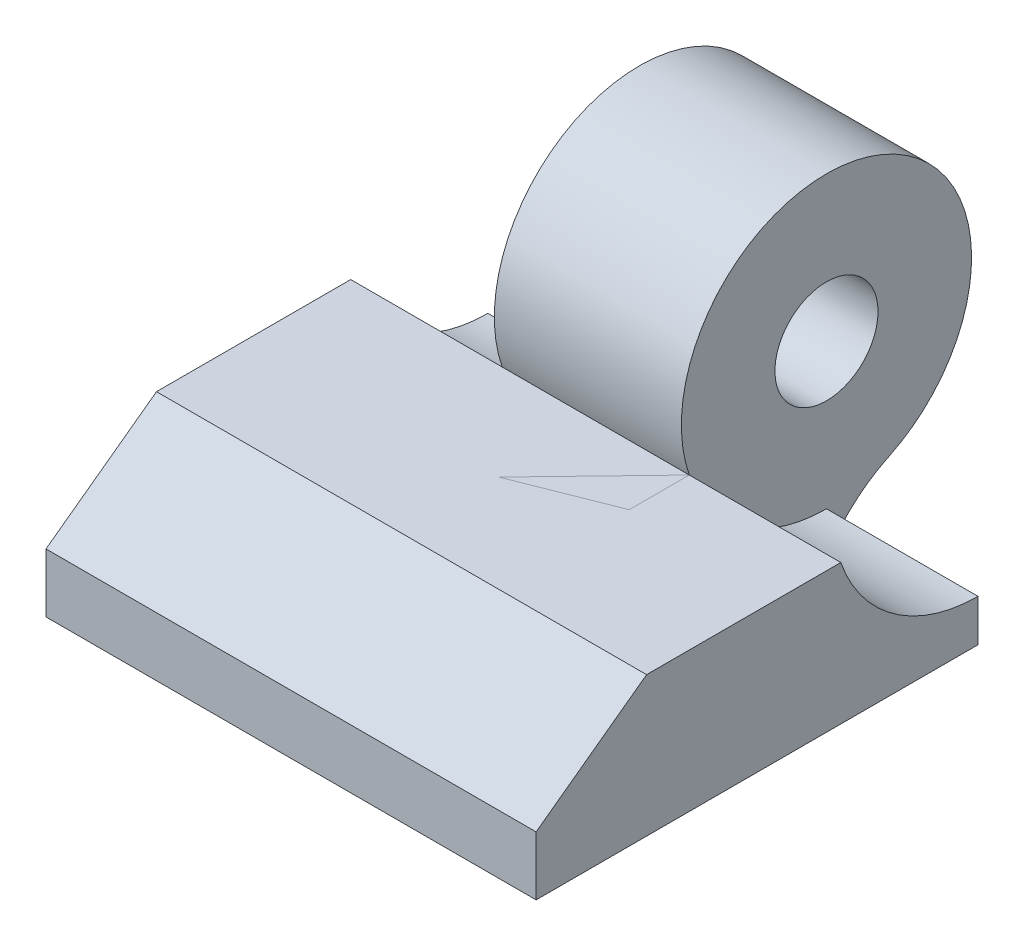
ISO-10303-21;
HEADER;
FILE_DESCRIPTION(('STEP AP214'),'2;1');
FILE_NAME('part.step','',(''),(''),'','','');
FILE_SCHEMA(('AUTOMOTIVE_DESIGN { 1 0 10303 214 1 1 1 1 }'));
ENDSEC;
DATA;
#1=APPLICATION_CONTEXT('core data for automotive mechanical design processes');
#2=APPLICATION_PROTOCOL_DEFINITION('international standard','automotive_design',2000,#1);
#3=PRODUCT_CONTEXT('',#1,'mechanical');
#4=PRODUCT('Part','Part','',(#3));
#5=PRODUCT_RELATED_PRODUCT_CATEGORY('part','',(#4));
#6=PRODUCT_DEFINITION_FORMATION('','',#4);
#7=PRODUCT_DEFINITION_CONTEXT('part definition',#1,'design');
#8=PRODUCT_DEFINITION('design','',#6,#7);
#9=PRODUCT_DEFINITION_SHAPE('','',#8);
#10=(LENGTH_UNIT() NAMED_UNIT(*) SI_UNIT(.MILLI.,.METRE.));
#11=(NAMED_UNIT(*) PLANE_ANGLE_UNIT() SI_UNIT($,.RADIAN.));
#12=(NAMED_UNIT(*) SI_UNIT($,.STERADIAN.) SOLID_ANGLE_UNIT());
#13=UNCERTAINTY_MEASURE_WITH_UNIT(LENGTH_MEASURE(1.E-05),#10,'distance_accuracy_value','');
#14=(GEOMETRIC_REPRESENTATION_CONTEXT(3) GLOBAL_UNCERTAINTY_ASSIGNED_CONTEXT((#13)) GLOBAL_UNIT_ASSIGNED_CONTEXT((#10,
#11,#12)) REPRESENTATION_CONTEXT('',''));
#15=CARTESIAN_POINT('',(0.,0.,0.));
#16=DIRECTION('',(0.,0.,1.));
#17=DIRECTION('',(1.,0.,0.));
#18=AXIS2_PLACEMENT_3D('',#15,#16,#17);
#19=CARTESIAN_POINT('',(16.637,0.,0.));
#20=DIRECTION('',(-1.,0.,0.));
#21=DIRECTION('',(0.,0.,1.));
#22=AXIS2_PLACEMENT_3D('',#19,#20,#21);
#23=CYLINDRICAL_SURFACE('',#22,9.85);
#24=CARTESIAN_POINT('',(-16.637,0.,0.));
#25=DIRECTION('',(1.,0.,0.));
#26=DIRECTION('',(0.,0.,-1.));
#27=AXIS2_PLACEMENT_3D('',#24,#25,#26);
#28=CIRCLE('',#27,9.85);
#29=CARTESIAN_POINT('',(-16.637,-3.20486621630946,9.31403953908068));
#30=VERTEX_POINT('',#29);
#31=CARTESIAN_POINT('',(-16.637,-9.85,0.));
#32=VERTEX_POINT('',#31);
#33=EDGE_CURVE('E132',#30,#32,#28,.T.);
#34=ORIENTED_EDGE('',*,*,#33,.F.);
#35=DIRECTION('',(-1.,0.,0.));
#36=VECTOR('',#35,1.);
#37=CARTESIAN_POINT('',(16.637,-3.20486621630946,9.31403953908068));
#38=LINE('',#37,#36);
#39=CARTESIAN_POINT('',(16.637,-3.20486621630946,9.31403953908068));
#40=VERTEX_POINT('',#39);
#41=EDGE_CURVE('E12',#40,#30,#38,.T.);
#42=ORIENTED_EDGE('',*,*,#41,.F.);
#43=CARTESIAN_POINT('',(16.637,0.,0.));
#44=DIRECTION('',(1.,0.,0.));
#45=DIRECTION('',(0.,0.,-1.));
#46=AXIS2_PLACEMENT_3D('',#43,#44,#45);
#47=CIRCLE('',#46,9.85);
#48=CARTESIAN_POINT('',(16.637,-9.85,0.));
#49=VERTEX_POINT('',#48);
#50=EDGE_CURVE('E143',#40,#49,#47,.T.);
#51=ORIENTED_EDGE('',*,*,#50,.T.);
#52=DIRECTION('',(-1.,0.,0.));
#53=VECTOR('',#52,1.);
#54=CARTESIAN_POINT('',(16.637,-9.85,0.));
#55=LINE('',#54,#53);
#56=EDGE_CURVE('E96',#49,#32,#55,.T.);
#57=ORIENTED_EDGE('',*,*,#56,.T.);
#58=EDGE_LOOP('',(#34,#42,#51,#57));
#59=FACE_BOUND('',#58,.T.);
#60=ADVANCED_FACE('F51',(#59),#23,.F.);
#61=CARTESIAN_POINT('',(16.637,-3.20486621630946,0.));
#62=DIRECTION('',(0.,-1.,0.));
#63=DIRECTION('',(0.,0.,-1.));
#64=AXIS2_PLACEMENT_3D('',#61,#62,#63);
#65=PLANE('',#64);
#66=DIRECTION('',(0.,0.,1.));
#67=VECTOR('',#66,1.);
#68=CARTESIAN_POINT('',(-16.637,-3.20486621630946,0.));
#69=LINE('',#68,#67);
#70=CARTESIAN_POINT('',(-16.637,-3.20486621630946,22.5));
#71=VERTEX_POINT('',#70);
#72=EDGE_CURVE('E135',#30,#71,#69,.T.);
#73=ORIENTED_EDGE('',*,*,#72,.T.);
#74=DIRECTION('',(-1.,0.,0.));
#75=VECTOR('',#74,1.);
#76=CARTESIAN_POINT('',(16.637,-3.20486621630946,22.5));
#77=LINE('',#76,#75);
#78=CARTESIAN_POINT('',(16.637,-3.20486621630946,22.5));
#79=VERTEX_POINT('',#78);
#80=EDGE_CURVE('E59',#79,#71,#77,.T.);
#81=ORIENTED_EDGE('',*,*,#80,.F.);
#82=DIRECTION('',(0.,0.,1.));
#83=VECTOR('',#82,1.);
#84=CARTESIAN_POINT('',(16.637,-3.20486621630946,0.));
#85=LINE('',#84,#83);
#86=EDGE_CURVE('E158',#40,#79,#85,.T.);
#87=ORIENTED_EDGE('',*,*,#86,.F.);
#88=ORIENTED_EDGE('',*,*,#41,.T.);
#89=EDGE_LOOP('',(#73,#81,#87,#88));
#90=FACE_BOUND('',#89,.T.);
#91=ADVANCED_FACE('F161',(#90),#65,.F.);
#92=CARTESIAN_POINT('',(16.637,8.64153137420128,6.33151613295937));
#93=DIRECTION('',(0.,-0.806654513100805,-0.591023262227557));
#94=DIRECTION('',(0.,0.591023262227557,-0.806654513100805));
#95=AXIS2_PLACEMENT_3D('',#92,#93,#94);
#96=PLANE('',#95);
#97=DIRECTION('',(0.,-0.591023262227557,0.806654513100805));
#98=VECTOR('',#97,1.);
#99=CARTESIAN_POINT('',(-16.637,8.64153137420128,6.33151613295937));
#100=LINE('',#99,#98);
#101=CARTESIAN_POINT('',(-16.637,-8.7,30.));
#102=VERTEX_POINT('',#101);
#103=EDGE_CURVE('E137',#71,#102,#100,.T.);
#104=ORIENTED_EDGE('',*,*,#103,.T.);
#105=DIRECTION('',(-1.,0.,0.));
#106=VECTOR('',#105,1.);
#107=CARTESIAN_POINT('',(16.637,-8.7,30.));
#108=LINE('',#107,#106);
#109=CARTESIAN_POINT('',(16.637,-8.7,30.));
#110=VERTEX_POINT('',#109);
#111=EDGE_CURVE('E124',#110,#102,#108,.T.);
#112=ORIENTED_EDGE('',*,*,#111,.F.);
#113=DIRECTION('',(0.,-0.591023262227557,0.806654513100805));
#114=VECTOR('',#113,1.);
#115=CARTESIAN_POINT('',(16.637,8.64153137420128,6.33151613295937));
#116=LINE('',#115,#114);
#117=EDGE_CURVE('E115',#79,#110,#116,.T.);
#118=ORIENTED_EDGE('',*,*,#117,.F.);
#119=ORIENTED_EDGE('',*,*,#80,.T.);
#120=EDGE_LOOP('',(#104,#112,#118,#119));
#121=FACE_BOUND('',#120,.T.);
#122=ADVANCED_FACE('F150',(#121),#96,.F.);
#123=CARTESIAN_POINT('',(16.637,0.,30.));
#124=DIRECTION('',(0.,0.,-1.));
#125=DIRECTION('',(-1.,0.,0.));
#126=AXIS2_PLACEMENT_3D('',#123,#124,#125);
#127=PLANE('',#126);
#128=DIRECTION('',(0.,-1.,0.));
#129=VECTOR('',#128,1.);
#130=CARTESIAN_POINT('',(-16.637,0.,30.));
#131=LINE('',#130,#129);
#132=CARTESIAN_POINT('',(-16.637,-12.7,30.));
#133=VERTEX_POINT('',#132);
#134=EDGE_CURVE('E123',#102,#133,#131,.T.);
#135=ORIENTED_EDGE('',*,*,#134,.T.);
#136=DIRECTION('',(-1.,0.,0.));
#137=VECTOR('',#136,1.);
#138=CARTESIAN_POINT('',(16.637,-12.7,30.));
#139=LINE('',#138,#137);
#140=CARTESIAN_POINT('',(16.637,-12.7,30.));
#141=VERTEX_POINT('',#140);
#142=EDGE_CURVE('E120',#141,#133,#139,.T.);
#143=ORIENTED_EDGE('',*,*,#142,.F.);
#144=DIRECTION('',(0.,-1.,0.));
#145=VECTOR('',#144,1.);
#146=CARTESIAN_POINT('',(16.637,0.,30.));
#147=LINE('',#146,#145);
#148=EDGE_CURVE('E109',#110,#141,#147,.T.);
#149=ORIENTED_EDGE('',*,*,#148,.F.);
#150=ORIENTED_EDGE('',*,*,#111,.T.);
#151=EDGE_LOOP('',(#135,#143,#149,#150));
#152=FACE_BOUND('',#151,.T.);
#153=ADVANCED_FACE('F121',(#152),#127,.F.);
#154=CARTESIAN_POINT('',(16.637,-12.7,0.));
#155=DIRECTION('',(0.,1.,0.));
#156=DIRECTION('',(0.,0.,1.));
#157=AXIS2_PLACEMENT_3D('',#154,#155,#156);
#158=PLANE('',#157);
#159=DIRECTION('',(0.,0.,-1.));
#160=VECTOR('',#159,1.);
#161=CARTESIAN_POINT('',(-16.637,-12.7,0.));
#162=LINE('',#161,#160);
#163=CARTESIAN_POINT('',(-16.637,-12.7,0.));
#164=VERTEX_POINT('',#163);
#165=EDGE_CURVE('E89',#133,#164,#162,.T.);
#166=ORIENTED_EDGE('',*,*,#165,.T.);
#167=DIRECTION('',(-1.,0.,0.));
#168=VECTOR('',#167,1.);
#169=CARTESIAN_POINT('',(16.637,-12.7,0.));
#170=LINE('',#169,#168);
#171=CARTESIAN_POINT('',(16.637,-12.7,0.));
#172=VERTEX_POINT('',#171);
#173=EDGE_CURVE('E125',#172,#164,#170,.T.);
#174=ORIENTED_EDGE('',*,*,#173,.F.);
#175=DIRECTION('',(0.,0.,-1.));
#176=VECTOR('',#175,1.);
#177=CARTESIAN_POINT('',(16.637,-12.7,0.));
#178=LINE('',#177,#176);
#179=EDGE_CURVE('E113',#141,#172,#178,.T.);
#180=ORIENTED_EDGE('',*,*,#179,.F.);
#181=ORIENTED_EDGE('',*,*,#142,.T.);
#182=EDGE_LOOP('',(#166,#174,#180,#181));
#183=FACE_BOUND('',#182,.T.);
#184=ADVANCED_FACE('F127',(#183),#158,.F.);
#185=CARTESIAN_POINT('',(16.637,0.,0.));
#186=DIRECTION('',(0.,0.,1.));
#187=DIRECTION('',(0.,-1.,0.));
#188=AXIS2_PLACEMENT_3D('',#185,#186,#187);
#189=PLANE('',#188);
#190=DIRECTION('',(0.,1.,0.));
#191=VECTOR('',#190,1.);
#192=CARTESIAN_POINT('',(-16.637,0.,0.));
#193=LINE('',#192,#191);
#194=EDGE_CURVE('E141',#164,#32,#193,.T.);
#195=ORIENTED_EDGE('',*,*,#194,.T.);
#196=ORIENTED_EDGE('',*,*,#56,.F.);
#197=DIRECTION('',(0.,1.,0.));
#198=VECTOR('',#197,1.);
#199=CARTESIAN_POINT('',(16.637,0.,0.));
#200=LINE('',#199,#198);
#201=EDGE_CURVE('E67',#172,#49,#200,.T.);
#202=ORIENTED_EDGE('',*,*,#201,.F.);
#203=ORIENTED_EDGE('',*,*,#173,.T.);
#204=EDGE_LOOP('',(#195,#196,#202,#203));
#205=FACE_BOUND('',#204,.T.);
#206=ADVANCED_FACE('F157',(#205),#189,.F.);
#207=CARTESIAN_POINT('',(16.637,0.,0.));
#208=DIRECTION('',(1.,0.,0.));
#209=DIRECTION('',(0.,0.,-1.));
#210=AXIS2_PLACEMENT_3D('',#207,#208,#209);
#211=PLANE('',#210);
#212=ORIENTED_EDGE('',*,*,#50,.F.);
#213=ORIENTED_EDGE('',*,*,#86,.T.);
#214=ORIENTED_EDGE('',*,*,#117,.T.);
#215=ORIENTED_EDGE('',*,*,#148,.T.);
#216=ORIENTED_EDGE('',*,*,#179,.T.);
#217=ORIENTED_EDGE('',*,*,#201,.T.);
#218=EDGE_LOOP('',(#212,#213,#214,#215,#216,#217));
#219=FACE_BOUND('',#218,.T.);
#220=ADVANCED_FACE('F111',(#219),#211,.T.);
#221=CARTESIAN_POINT('',(-16.637,0.,0.));
#222=DIRECTION('',(1.,0.,0.));
#223=DIRECTION('',(0.,0.,-1.));
#224=AXIS2_PLACEMENT_3D('',#221,#222,#223);
#225=PLANE('',#224);
#226=ORIENTED_EDGE('',*,*,#33,.T.);
#227=ORIENTED_EDGE('',*,*,#194,.F.);
#228=ORIENTED_EDGE('',*,*,#165,.F.);
#229=ORIENTED_EDGE('',*,*,#134,.F.);
#230=ORIENTED_EDGE('',*,*,#103,.F.);
#231=ORIENTED_EDGE('',*,*,#72,.F.);
#232=EDGE_LOOP('',(#226,#227,#228,#229,#230,#231));
#233=FACE_BOUND('',#232,.T.);
#234=ADVANCED_FACE('F154',(#233),#225,.F.);
#235=CLOSED_SHELL('',(#60,#91,#122,#153,#184,#206,#220,#234));
#236=MANIFOLD_SOLID_BREP('B2',#235);
#237=CARTESIAN_POINT('',(6.35,0.,0.));
#238=DIRECTION('',(1.,0.,0.));
#239=DIRECTION('',(0.,0.,-1.));
#240=AXIS2_PLACEMENT_3D('',#237,#238,#239);
#241=PLANE('',#240);
#242=DIRECTION('',(0.,0.,-1.));
#243=VECTOR('',#242,1.);
#244=CARTESIAN_POINT('',(6.35,-12.7,0.));
#245=LINE('',#244,#243);
#246=CARTESIAN_POINT('',(6.35,-12.7,30.));
#247=VERTEX_POINT('',#246);
#248=CARTESIAN_POINT('',(6.35,-12.7,0.));
#249=VERTEX_POINT('',#248);
#250=EDGE_CURVE('E336',#247,#249,#245,.T.);
#251=ORIENTED_EDGE('',*,*,#250,.T.);
#252=CARTESIAN_POINT('',(6.35,-17.925688976378,-8.52597060293794));
#253=DIRECTION('',(1.,0.,0.));
#254=DIRECTION('',(0.,0.,-1.));
#255=AXIS2_PLACEMENT_3D('',#252,#253,#254);
#256=CIRCLE('',#255,10.);
#257=CARTESIAN_POINT('',(6.35,-8.89511518475178,-4.23077130674754));
#258=VERTEX_POINT('',#257);
#259=EDGE_CURVE('E49',#249,#258,#256,.F.);
#260=ORIENTED_EDGE('',*,*,#259,.T.);
#261=CARTESIAN_POINT('',(6.35,0.,0.));
#262=DIRECTION('',(1.,0.,0.));
#263=DIRECTION('',(0.,0.,-1.));
#264=AXIS2_PLACEMENT_3D('',#261,#262,#263);
#265=CIRCLE('',#264,9.85);
#266=CARTESIAN_POINT('',(6.35,-3.20486621630946,9.31403953908068));
#267=VERTEX_POINT('',#266);
#268=EDGE_CURVE('E307',#258,#267,#265,.T.);
#269=ORIENTED_EDGE('',*,*,#268,.T.);
#270=DIRECTION('',(0.,0.,1.));
#271=VECTOR('',#270,1.);
#272=CARTESIAN_POINT('',(6.35,-3.20486621630946,22.5));
#273=LINE('',#272,#271);
#274=CARTESIAN_POINT('',(6.35,-3.20486621630946,22.5));
#275=VERTEX_POINT('',#274);
#276=EDGE_CURVE('E311',#267,#275,#273,.T.);
#277=ORIENTED_EDGE('',*,*,#276,.T.);
#278=DIRECTION('',(0.,-0.591023262227557,0.806654513100805));
#279=VECTOR('',#278,1.);
#280=CARTESIAN_POINT('',(6.35,-8.7,30.));
#281=LINE('',#280,#279);
#282=CARTESIAN_POINT('',(6.35,-8.7,30.));
#283=VERTEX_POINT('',#282);
#284=EDGE_CURVE('E329',#275,#283,#281,.T.);
#285=ORIENTED_EDGE('',*,*,#284,.T.);
#286=DIRECTION('',(0.,-1.,0.));
#287=VECTOR('',#286,1.);
#288=CARTESIAN_POINT('',(6.35,-12.7,30.));
#289=LINE('',#288,#287);
#290=EDGE_CURVE('E331',#283,#247,#289,.T.);
#291=ORIENTED_EDGE('',*,*,#290,.T.);
#292=EDGE_LOOP('',(#251,#260,#269,#277,#285,#291));
#293=FACE_BOUND('',#292,.T.);
#294=CARTESIAN_POINT('',(6.35,0.,0.));
#295=DIRECTION('',(1.,0.,0.));
#296=DIRECTION('',(0.,0.,-1.));
#297=AXIS2_PLACEMENT_3D('',#294,#295,#296);
#298=CIRCLE('',#297,3.5);
#299=CARTESIAN_POINT('',(6.35,0.,-3.5));
#300=VERTEX_POINT('',#299);
#301=EDGE_CURVE('E341',#300,#300,#298,.T.);
#302=ORIENTED_EDGE('',*,*,#301,.F.);
#303=EDGE_LOOP('',(#302));
#304=FACE_BOUND('',#303,.T.);
#305=ADVANCED_FACE('F259',(#293,#304),#241,.T.);
#306=CARTESIAN_POINT('',(-6.35,0.,0.));
#307=DIRECTION('',(1.,0.,0.));
#308=DIRECTION('',(0.,0.,-1.));
#309=AXIS2_PLACEMENT_3D('',#306,#307,#308);
#310=PLANE('',#309);
#311=CARTESIAN_POINT('',(-6.35,0.,0.));
#312=DIRECTION('',(1.,0.,0.));
#313=DIRECTION('',(0.,0.,-1.));
#314=AXIS2_PLACEMENT_3D('',#311,#312,#313);
#315=CIRCLE('',#314,9.85);
#316=CARTESIAN_POINT('',(-6.35,-8.89511518475178,-4.23077130674754));
#317=VERTEX_POINT('',#316);
#318=CARTESIAN_POINT('',(-6.35,-3.20486621630946,9.31403953908068));
#319=VERTEX_POINT('',#318);
#320=EDGE_CURVE('E320',#317,#319,#315,.T.);
#321=ORIENTED_EDGE('',*,*,#320,.F.);
#322=CARTESIAN_POINT('',(-6.35,-17.925688976378,-8.52597060293794));
#323=DIRECTION('',(1.,0.,0.));
#324=DIRECTION('',(0.,0.,-1.));
#325=AXIS2_PLACEMENT_3D('',#322,#323,#324);
#326=CIRCLE('',#325,10.);
#327=CARTESIAN_POINT('',(-6.35,-12.7,0.));
#328=VERTEX_POINT('',#327);
#329=EDGE_CURVE('E267',#317,#328,#326,.T.);
#330=ORIENTED_EDGE('',*,*,#329,.T.);
#331=DIRECTION('',(0.,0.,-1.));
#332=VECTOR('',#331,1.);
#333=CARTESIAN_POINT('',(-6.35,-12.7,0.));
#334=LINE('',#333,#332);
#335=CARTESIAN_POINT('',(-6.35,-12.7,30.));
#336=VERTEX_POINT('',#335);
#337=EDGE_CURVE('E314',#336,#328,#334,.T.);
#338=ORIENTED_EDGE('',*,*,#337,.F.);
#339=DIRECTION('',(0.,-1.,0.));
#340=VECTOR('',#339,1.);
#341=CARTESIAN_POINT('',(-6.35,-12.7,30.));
#342=LINE('',#341,#340);
#343=CARTESIAN_POINT('',(-6.35,-8.7,30.));
#344=VERTEX_POINT('',#343);
#345=EDGE_CURVE('E345',#344,#336,#342,.T.);
#346=ORIENTED_EDGE('',*,*,#345,.F.);
#347=DIRECTION('',(0.,-0.591023262227557,0.806654513100805));
#348=VECTOR('',#347,1.);
#349=CARTESIAN_POINT('',(-6.35,-8.7,30.));
#350=LINE('',#349,#348);
#351=CARTESIAN_POINT('',(-6.35,-3.20486621630946,22.5));
#352=VERTEX_POINT('',#351);
#353=EDGE_CURVE('E343',#352,#344,#350,.T.);
#354=ORIENTED_EDGE('',*,*,#353,.F.);
#355=DIRECTION('',(0.,0.,1.));
#356=VECTOR('',#355,1.);
#357=CARTESIAN_POINT('',(-6.35,-3.20486621630946,22.5));
#358=LINE('',#357,#356);
#359=EDGE_CURVE('E340',#319,#352,#358,.T.);
#360=ORIENTED_EDGE('',*,*,#359,.F.);
#361=EDGE_LOOP('',(#321,#330,#338,#346,#354,#360));
#362=FACE_BOUND('',#361,.T.);
#363=CARTESIAN_POINT('',(-6.35,0.,0.));
#364=DIRECTION('',(1.,0.,0.));
#365=DIRECTION('',(0.,0.,-1.));
#366=AXIS2_PLACEMENT_3D('',#363,#364,#365);
#367=CIRCLE('',#366,3.5);
#368=CARTESIAN_POINT('',(-6.35,0.,-3.5));
#369=VERTEX_POINT('',#368);
#370=EDGE_CURVE('E487',#369,#369,#367,.T.);
#371=ORIENTED_EDGE('',*,*,#370,.T.);
#372=EDGE_LOOP('',(#371));
#373=FACE_BOUND('',#372,.T.);
#374=ADVANCED_FACE('F359',(#362,#373),#310,.F.);
#375=CARTESIAN_POINT('',(6.35,0.,0.));
#376=DIRECTION('',(-1.,0.,0.));
#377=DIRECTION('',(0.,0.,1.));
#378=AXIS2_PLACEMENT_3D('',#375,#376,#377);
#379=CYLINDRICAL_SURFACE('',#378,9.85);
#380=ORIENTED_EDGE('',*,*,#268,.F.);
#381=DIRECTION('',(-1.,0.,0.));
#382=VECTOR('',#381,1.);
#383=CARTESIAN_POINT('',(6.35,-8.89511518475178,-4.23077130674754));
#384=LINE('',#383,#382);
#385=EDGE_CURVE('E323',#258,#317,#384,.T.);
#386=ORIENTED_EDGE('',*,*,#385,.T.);
#387=ORIENTED_EDGE('',*,*,#320,.T.);
#388=DIRECTION('',(-1.,0.,0.));
#389=VECTOR('',#388,1.);
#390=CARTESIAN_POINT('',(6.35,-3.20486621630946,9.31403953908068));
#391=LINE('',#390,#389);
#392=EDGE_CURVE('E317',#267,#319,#391,.T.);
#393=ORIENTED_EDGE('',*,*,#392,.F.);
#394=EDGE_LOOP('',(#380,#386,#387,#393));
#395=FACE_BOUND('',#394,.T.);
#396=ADVANCED_FACE('F318',(#395),#379,.T.);
#397=CARTESIAN_POINT('',(6.35,-3.20486621630946,22.5));
#398=DIRECTION('',(0.,-1.,0.));
#399=DIRECTION('',(0.,0.,-1.));
#400=AXIS2_PLACEMENT_3D('',#397,#398,#399);
#401=PLANE('',#400);
#402=ORIENTED_EDGE('',*,*,#359,.T.);
#403=DIRECTION('',(-1.,0.,0.));
#404=VECTOR('',#403,1.);
#405=CARTESIAN_POINT('',(6.35,-3.20486621630946,22.5));
#406=LINE('',#405,#404);
#407=EDGE_CURVE('E324',#275,#352,#406,.T.);
#408=ORIENTED_EDGE('',*,*,#407,.F.);
#409=ORIENTED_EDGE('',*,*,#276,.F.);
#410=ORIENTED_EDGE('',*,*,#392,.T.);
#411=EDGE_LOOP('',(#402,#408,#409,#410));
#412=FACE_BOUND('',#411,.T.);
#413=ADVANCED_FACE('F326',(#412),#401,.F.);
#414=CARTESIAN_POINT('',(6.35,-8.7,30.));
#415=DIRECTION('',(0.,-0.806654513100805,-0.591023262227557));
#416=DIRECTION('',(0.,0.591023262227557,-0.806654513100805));
#417=AXIS2_PLACEMENT_3D('',#414,#415,#416);
#418=PLANE('',#417);
#419=ORIENTED_EDGE('',*,*,#353,.T.);
#420=DIRECTION('',(-1.,0.,0.));
#421=VECTOR('',#420,1.);
#422=CARTESIAN_POINT('',(6.35,-8.7,30.));
#423=LINE('',#422,#421);
#424=EDGE_CURVE('E353',#283,#344,#423,.T.);
#425=ORIENTED_EDGE('',*,*,#424,.F.);
#426=ORIENTED_EDGE('',*,*,#284,.F.);
#427=ORIENTED_EDGE('',*,*,#407,.T.);
#428=EDGE_LOOP('',(#419,#425,#426,#427));
#429=FACE_BOUND('',#428,.T.);
#430=ADVANCED_FACE('F386',(#429),#418,.F.);
#431=CARTESIAN_POINT('',(6.35,-12.7,30.));
#432=DIRECTION('',(0.,0.,-1.));
#433=DIRECTION('',(-1.,0.,0.));
#434=AXIS2_PLACEMENT_3D('',#431,#432,#433);
#435=PLANE('',#434);
#436=ORIENTED_EDGE('',*,*,#345,.T.);
#437=DIRECTION('',(-1.,0.,0.));
#438=VECTOR('',#437,1.);
#439=CARTESIAN_POINT('',(6.35,-12.7,30.));
#440=LINE('',#439,#438);
#441=EDGE_CURVE('E350',#247,#336,#440,.T.);
#442=ORIENTED_EDGE('',*,*,#441,.F.);
#443=ORIENTED_EDGE('',*,*,#290,.F.);
#444=ORIENTED_EDGE('',*,*,#424,.T.);
#445=EDGE_LOOP('',(#436,#442,#443,#444));
#446=FACE_BOUND('',#445,.T.);
#447=ADVANCED_FACE('F383',(#446),#435,.F.);
#448=CARTESIAN_POINT('',(6.35,-12.7,0.));
#449=DIRECTION('',(0.,1.,0.));
#450=DIRECTION('',(0.,0.,1.));
#451=AXIS2_PLACEMENT_3D('',#448,#449,#450);
#452=PLANE('',#451);
#453=ORIENTED_EDGE('',*,*,#337,.T.);
#454=DIRECTION('',(-1.,0.,0.));
#455=VECTOR('',#454,1.);
#456=CARTESIAN_POINT('',(6.35,-12.7,0.));
#457=LINE('',#456,#455);
#458=EDGE_CURVE('E338',#249,#328,#457,.T.);
#459=ORIENTED_EDGE('',*,*,#458,.F.);
#460=ORIENTED_EDGE('',*,*,#250,.F.);
#461=ORIENTED_EDGE('',*,*,#441,.T.);
#462=EDGE_LOOP('',(#453,#459,#460,#461));
#463=FACE_BOUND('',#462,.T.);
#464=ADVANCED_FACE('F364',(#463),#452,.F.);
#465=CARTESIAN_POINT('',(6.35,0.,0.));
#466=DIRECTION('',(-1.,0.,0.));
#467=DIRECTION('',(0.,0.,1.));
#468=AXIS2_PLACEMENT_3D('',#465,#466,#467);
#469=CYLINDRICAL_SURFACE('',#468,3.5);
#470=ORIENTED_EDGE('',*,*,#301,.T.);
#471=EDGE_LOOP('',(#470));
#472=FACE_BOUND('',#471,.T.);
#473=ORIENTED_EDGE('',*,*,#370,.F.);
#474=EDGE_LOOP('',(#473));
#475=FACE_BOUND('',#474,.T.);
#476=ADVANCED_FACE('F368',(#472,#475),#469,.F.);
#477=CARTESIAN_POINT('',(6.35,-17.925688976378,-8.52597060293794));
#478=DIRECTION('',(1.,0.,0.));
#479=DIRECTION('',(0.,0.,-1.));
#480=AXIS2_PLACEMENT_3D('',#477,#478,#479);
#481=CYLINDRICAL_SURFACE('',#480,10.);
#482=ORIENTED_EDGE('',*,*,#259,.F.);
#483=ORIENTED_EDGE('',*,*,#458,.T.);
#484=ORIENTED_EDGE('',*,*,#329,.F.);
#485=ORIENTED_EDGE('',*,*,#385,.F.);
#486=EDGE_LOOP('',(#482,#483,#484,#485));
#487=FACE_BOUND('',#486,.T.);
#488=ADVANCED_FACE('F261',(#487),#481,.F.);
#489=CLOSED_SHELL('',(#305,#374,#396,#413,#430,#447,#464,#476,#488));
#490=MANIFOLD_SOLID_BREP('B6',#489);
#491=ADVANCED_BREP_SHAPE_REPRESENTATION('',(#18,#236,#490),#14);
#492=SHAPE_DEFINITION_REPRESENTATION(#9,#491);
ENDSEC;
END-ISO-10303-21;
